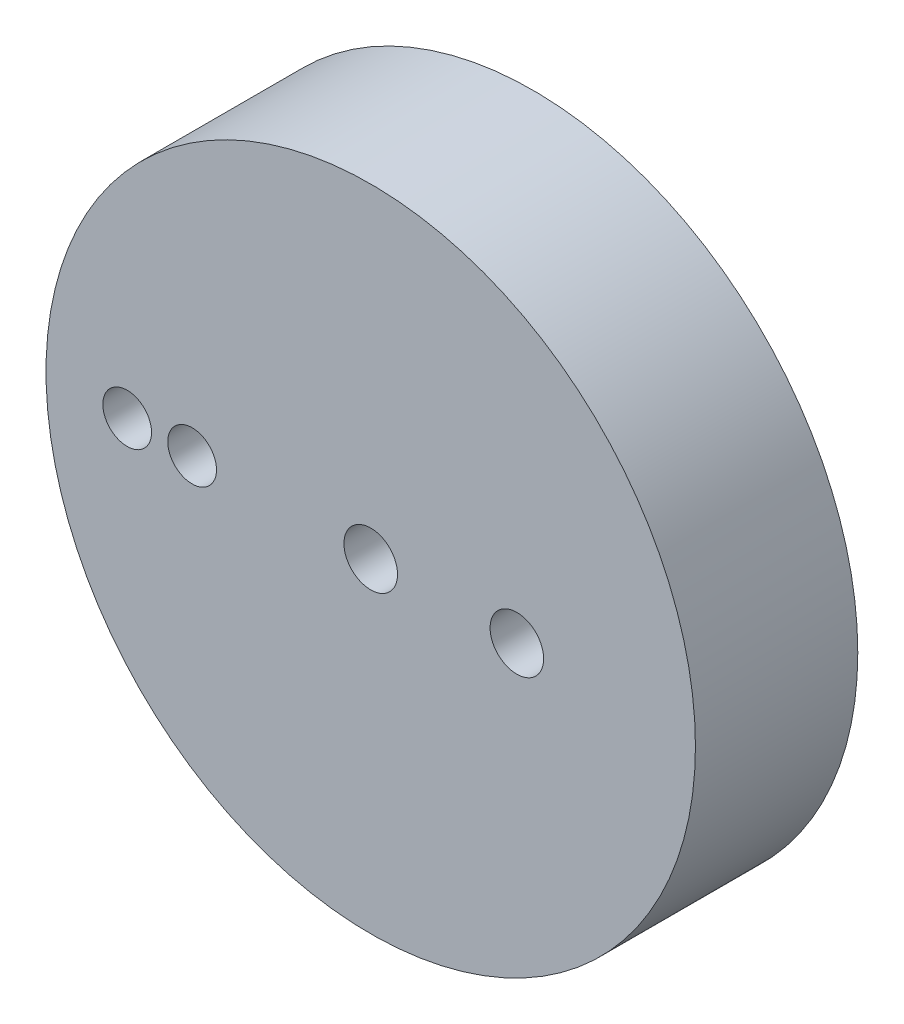
ISO-10303-21;
HEADER;
FILE_DESCRIPTION(('STEP AP214'),'2;1');
FILE_NAME('part.step','',(''),(''),'','','');
FILE_SCHEMA(('AUTOMOTIVE_DESIGN { 1 0 10303 214 1 1 1 1 }'));
ENDSEC;
DATA;
#1=APPLICATION_CONTEXT('core data for automotive mechanical design processes');
#2=APPLICATION_PROTOCOL_DEFINITION('international standard','automotive_design',2000,#1);
#3=PRODUCT_CONTEXT('',#1,'mechanical');
#4=PRODUCT('Part','Part','',(#3));
#5=PRODUCT_RELATED_PRODUCT_CATEGORY('part','',(#4));
#6=PRODUCT_DEFINITION_FORMATION('','',#4);
#7=PRODUCT_DEFINITION_CONTEXT('part definition',#1,'design');
#8=PRODUCT_DEFINITION('design','',#6,#7);
#9=PRODUCT_DEFINITION_SHAPE('','',#8);
#10=(LENGTH_UNIT() NAMED_UNIT(*) SI_UNIT(.MILLI.,.METRE.));
#11=(NAMED_UNIT(*) PLANE_ANGLE_UNIT() SI_UNIT($,.RADIAN.));
#12=(NAMED_UNIT(*) SI_UNIT($,.STERADIAN.) SOLID_ANGLE_UNIT());
#13=UNCERTAINTY_MEASURE_WITH_UNIT(LENGTH_MEASURE(1.E-05),#10,'distance_accuracy_value','');
#14=(GEOMETRIC_REPRESENTATION_CONTEXT(3) GLOBAL_UNCERTAINTY_ASSIGNED_CONTEXT((#13)) GLOBAL_UNIT_ASSIGNED_CONTEXT((#10,
#11,#12)) REPRESENTATION_CONTEXT('',''));
#15=CARTESIAN_POINT('',(0.,0.,0.));
#16=DIRECTION('',(0.,0.,1.));
#17=DIRECTION('',(1.,0.,0.));
#18=AXIS2_PLACEMENT_3D('',#15,#16,#17);
#19=CARTESIAN_POINT('',(0.,0.,21.));
#20=DIRECTION('',(0.,0.,-1.));
#21=DIRECTION('',(-1.,0.,0.));
#22=AXIS2_PLACEMENT_3D('',#19,#20,#21);
#23=CYLINDRICAL_SURFACE('',#22,7.7);
#24=DIRECTION('',(0.,0.,-1.));
#25=VECTOR('',#24,1.);
#26=CARTESIAN_POINT('',(-4.89963263929042,-5.94,21.));
#27=LINE('',#26,#25);
#28=CARTESIAN_POINT('',(-4.89963263929042,-5.94,17.5));
#29=VERTEX_POINT('',#28);
#30=CARTESIAN_POINT('',(-4.89963263929042,-5.94,11.));
#31=VERTEX_POINT('',#30);
#32=EDGE_CURVE('E11',#29,#31,#27,.T.);
#33=ORIENTED_EDGE('',*,*,#32,.F.);
#34=CARTESIAN_POINT('',(0.,0.,17.5));
#35=DIRECTION('',(0.,0.,1.));
#36=DIRECTION('',(1.,0.,0.));
#37=AXIS2_PLACEMENT_3D('',#34,#35,#36);
#38=CIRCLE('',#37,7.7);
#39=CARTESIAN_POINT('',(-4.89963263929042,5.93999999999999,17.5));
#40=VERTEX_POINT('',#39);
#41=EDGE_CURVE('E106',#29,#40,#38,.T.);
#42=ORIENTED_EDGE('',*,*,#41,.T.);
#43=DIRECTION('',(0.,0.,-1.));
#44=VECTOR('',#43,1.);
#45=CARTESIAN_POINT('',(-4.89963263929042,5.93999999999999,21.));
#46=LINE('',#45,#44);
#47=CARTESIAN_POINT('',(-4.89963263929042,5.93999999999999,11.));
#48=VERTEX_POINT('',#47);
#49=EDGE_CURVE('E91',#40,#48,#46,.T.);
#50=ORIENTED_EDGE('',*,*,#49,.T.);
#51=CARTESIAN_POINT('',(0.,0.,11.));
#52=DIRECTION('',(0.,0.,1.));
#53=DIRECTION('',(1.,0.,0.));
#54=AXIS2_PLACEMENT_3D('',#51,#52,#53);
#55=CIRCLE('',#54,7.7);
#56=EDGE_CURVE('E139',#31,#48,#55,.T.);
#57=ORIENTED_EDGE('',*,*,#56,.F.);
#58=EDGE_LOOP('',(#33,#42,#50,#57));
#59=FACE_BOUND('',#58,.T.);
#60=ADVANCED_FACE('F39',(#59),#23,.F.);
#61=CARTESIAN_POINT('',(-11.13552872566,-13.5,21.));
#62=DIRECTION('',(0.,0.,-1.));
#63=DIRECTION('',(-1.,0.,0.));
#64=AXIS2_PLACEMENT_3D('',#61,#62,#63);
#65=CYLINDRICAL_SURFACE('',#64,9.8);
#66=CARTESIAN_POINT('',(-11.13552872566,-13.5,17.5));
#67=DIRECTION('',(0.,0.,1.));
#68=DIRECTION('',(1.,0.,0.));
#69=AXIS2_PLACEMENT_3D('',#66,#67,#68);
#70=CIRCLE('',#69,9.8);
#71=CARTESIAN_POINT('',(-11.13552872566,-3.7,17.5));
#72=VERTEX_POINT('',#71);
#73=EDGE_CURVE('E53',#29,#72,#70,.T.);
#74=ORIENTED_EDGE('',*,*,#73,.F.);
#75=ORIENTED_EDGE('',*,*,#32,.T.);
#76=CARTESIAN_POINT('',(-11.13552872566,-13.5,11.));
#77=DIRECTION('',(0.,0.,1.));
#78=DIRECTION('',(1.,0.,0.));
#79=AXIS2_PLACEMENT_3D('',#76,#77,#78);
#80=CIRCLE('',#79,9.8);
#81=CARTESIAN_POINT('',(-11.13552872566,-3.7,11.));
#82=VERTEX_POINT('',#81);
#83=EDGE_CURVE('E141',#31,#82,#80,.T.);
#84=ORIENTED_EDGE('',*,*,#83,.T.);
#85=DIRECTION('',(0.,0.,-1.));
#86=VECTOR('',#85,1.);
#87=CARTESIAN_POINT('',(-11.13552872566,-3.7,21.));
#88=LINE('',#87,#86);
#89=EDGE_CURVE('E47',#72,#82,#88,.T.);
#90=ORIENTED_EDGE('',*,*,#89,.F.);
#91=EDGE_LOOP('',(#74,#75,#84,#90));
#92=FACE_BOUND('',#91,.T.);
#93=ADVANCED_FACE('F165',(#92),#65,.T.);
#94=CARTESIAN_POINT('',(0.,-3.7,21.));
#95=DIRECTION('',(0.,-1.,0.));
#96=DIRECTION('',(1.,0.,0.));
#97=AXIS2_PLACEMENT_3D('',#94,#95,#96);
#98=PLANE('',#97);
#99=DIRECTION('',(-1.,0.,0.));
#100=VECTOR('',#99,1.);
#101=CARTESIAN_POINT('',(0.,-3.7,17.5));
#102=LINE('',#101,#100);
#103=CARTESIAN_POINT('',(-24.,-3.7,17.5));
#104=VERTEX_POINT('',#103);
#105=EDGE_CURVE('E61',#72,#104,#102,.T.);
#106=ORIENTED_EDGE('',*,*,#105,.F.);
#107=ORIENTED_EDGE('',*,*,#89,.T.);
#108=DIRECTION('',(-1.,0.,0.));
#109=VECTOR('',#108,1.);
#110=CARTESIAN_POINT('',(0.,-3.7,11.));
#111=LINE('',#110,#109);
#112=CARTESIAN_POINT('',(-24.,-3.7,11.));
#113=VERTEX_POINT('',#112);
#114=EDGE_CURVE('E144',#82,#113,#111,.T.);
#115=ORIENTED_EDGE('',*,*,#114,.T.);
#116=DIRECTION('',(0.,0.,-1.));
#117=VECTOR('',#116,1.);
#118=CARTESIAN_POINT('',(-24.,-3.7,21.));
#119=LINE('',#118,#117);
#120=EDGE_CURVE('E157',#104,#113,#119,.T.);
#121=ORIENTED_EDGE('',*,*,#120,.F.);
#122=EDGE_LOOP('',(#106,#107,#115,#121));
#123=FACE_BOUND('',#122,.T.);
#124=ADVANCED_FACE('F159',(#123),#98,.F.);
#125=CARTESIAN_POINT('',(-24.,0.,21.));
#126=DIRECTION('',(0.,0.,-1.));
#127=DIRECTION('',(-1.,0.,0.));
#128=AXIS2_PLACEMENT_3D('',#125,#126,#127);
#129=CYLINDRICAL_SURFACE('',#128,3.7);
#130=DIRECTION('',(0.,0.,-1.));
#131=VECTOR('',#130,1.);
#132=CARTESIAN_POINT('',(-24.,3.7,21.));
#133=LINE('',#132,#131);
#134=CARTESIAN_POINT('',(-24.,3.7,17.5));
#135=VERTEX_POINT('',#134);
#136=CARTESIAN_POINT('',(-24.,3.7,11.));
#137=VERTEX_POINT('',#136);
#138=EDGE_CURVE('E155',#135,#137,#133,.T.);
#139=ORIENTED_EDGE('',*,*,#138,.F.);
#140=CARTESIAN_POINT('',(-24.,0.,17.5));
#141=DIRECTION('',(0.,0.,1.));
#142=DIRECTION('',(1.,0.,0.));
#143=AXIS2_PLACEMENT_3D('',#140,#141,#142);
#144=CIRCLE('',#143,3.7);
#145=EDGE_CURVE('E115',#135,#104,#144,.T.);
#146=ORIENTED_EDGE('',*,*,#145,.T.);
#147=ORIENTED_EDGE('',*,*,#120,.T.);
#148=CARTESIAN_POINT('',(-24.,0.,11.));
#149=DIRECTION('',(0.,0.,1.));
#150=DIRECTION('',(1.,0.,0.));
#151=AXIS2_PLACEMENT_3D('',#148,#149,#150);
#152=CIRCLE('',#151,3.7);
#153=EDGE_CURVE('E147',#137,#113,#152,.T.);
#154=ORIENTED_EDGE('',*,*,#153,.F.);
#155=EDGE_LOOP('',(#139,#146,#147,#154));
#156=FACE_BOUND('',#155,.T.);
#157=ADVANCED_FACE('F172',(#156),#129,.F.);
#158=CARTESIAN_POINT('',(0.,3.7,21.));
#159=DIRECTION('',(0.,1.,0.));
#160=DIRECTION('',(-1.,0.,0.));
#161=AXIS2_PLACEMENT_3D('',#158,#159,#160);
#162=PLANE('',#161);
#163=DIRECTION('',(1.,0.,0.));
#164=VECTOR('',#163,1.);
#165=CARTESIAN_POINT('',(0.,3.7,17.5));
#166=LINE('',#165,#164);
#167=CARTESIAN_POINT('',(-11.13552872566,3.7,17.5));
#168=VERTEX_POINT('',#167);
#169=EDGE_CURVE('E113',#135,#168,#166,.T.);
#170=ORIENTED_EDGE('',*,*,#169,.F.);
#171=ORIENTED_EDGE('',*,*,#138,.T.);
#172=DIRECTION('',(1.,0.,0.));
#173=VECTOR('',#172,1.);
#174=CARTESIAN_POINT('',(0.,3.7,11.));
#175=LINE('',#174,#173);
#176=CARTESIAN_POINT('',(-11.13552872566,3.7,11.));
#177=VERTEX_POINT('',#176);
#178=EDGE_CURVE('E150',#137,#177,#175,.T.);
#179=ORIENTED_EDGE('',*,*,#178,.T.);
#180=DIRECTION('',(0.,0.,-1.));
#181=VECTOR('',#180,1.);
#182=CARTESIAN_POINT('',(-11.13552872566,3.7,21.));
#183=LINE('',#182,#181);
#184=EDGE_CURVE('E102',#168,#177,#183,.T.);
#185=ORIENTED_EDGE('',*,*,#184,.F.);
#186=EDGE_LOOP('',(#170,#171,#179,#185));
#187=FACE_BOUND('',#186,.T.);
#188=ADVANCED_FACE('F178',(#187),#162,.F.);
#189=CARTESIAN_POINT('',(-11.13552872566,13.5,21.));
#190=DIRECTION('',(0.,0.,-1.));
#191=DIRECTION('',(-1.,0.,0.));
#192=AXIS2_PLACEMENT_3D('',#189,#190,#191);
#193=CYLINDRICAL_SURFACE('',#192,9.8);
#194=CARTESIAN_POINT('',(-11.13552872566,13.5,17.5));
#195=DIRECTION('',(0.,0.,1.));
#196=DIRECTION('',(1.,0.,0.));
#197=AXIS2_PLACEMENT_3D('',#194,#195,#196);
#198=CIRCLE('',#197,9.8);
#199=EDGE_CURVE('E95',#168,#40,#198,.T.);
#200=ORIENTED_EDGE('',*,*,#199,.F.);
#201=ORIENTED_EDGE('',*,*,#184,.T.);
#202=CARTESIAN_POINT('',(-11.13552872566,13.5,11.));
#203=DIRECTION('',(0.,0.,1.));
#204=DIRECTION('',(1.,0.,0.));
#205=AXIS2_PLACEMENT_3D('',#202,#203,#204);
#206=CIRCLE('',#205,9.8);
#207=EDGE_CURVE('E98',#177,#48,#206,.T.);
#208=ORIENTED_EDGE('',*,*,#207,.T.);
#209=ORIENTED_EDGE('',*,*,#49,.F.);
#210=EDGE_LOOP('',(#200,#201,#208,#209));
#211=FACE_BOUND('',#210,.T.);
#212=ADVANCED_FACE('F93',(#211),#193,.T.);
#213=CARTESIAN_POINT('',(-9.,0.,21.));
#214=DIRECTION('',(0.,0.,-1.));
#215=DIRECTION('',(-1.,0.,0.));
#216=AXIS2_PLACEMENT_3D('',#213,#214,#215);
#217=CYLINDRICAL_SURFACE('',#216,20.);
#218=CARTESIAN_POINT('',(-9.,0.,21.));
#219=DIRECTION('',(0.,0.,1.));
#220=DIRECTION('',(1.,0.,0.));
#221=AXIS2_PLACEMENT_3D('',#218,#219,#220);
#222=CIRCLE('',#221,20.);
#223=CARTESIAN_POINT('',(11.,0.,21.));
#224=VERTEX_POINT('',#223);
#225=EDGE_CURVE('E103',#224,#224,#222,.T.);
#226=ORIENTED_EDGE('',*,*,#225,.F.);
#227=EDGE_LOOP('',(#226));
#228=FACE_BOUND('',#227,.T.);
#229=CARTESIAN_POINT('',(-9.,0.,11.));
#230=DIRECTION('',(0.,0.,1.));
#231=DIRECTION('',(1.,0.,0.));
#232=AXIS2_PLACEMENT_3D('',#229,#230,#231);
#233=CIRCLE('',#232,20.);
#234=CARTESIAN_POINT('',(11.,0.,11.));
#235=VERTEX_POINT('',#234);
#236=EDGE_CURVE('E127',#235,#235,#233,.T.);
#237=ORIENTED_EDGE('',*,*,#236,.T.);
#238=EDGE_LOOP('',(#237));
#239=FACE_BOUND('',#238,.T.);
#240=ADVANCED_FACE('F41',(#228,#239),#217,.T.);
#241=CARTESIAN_POINT('',(0.,0.,21.));
#242=DIRECTION('',(0.,0.,1.));
#243=DIRECTION('',(1.,0.,0.));
#244=AXIS2_PLACEMENT_3D('',#241,#242,#243);
#245=PLANE('',#244);
#246=CARTESIAN_POINT('',(0.,0.,21.));
#247=DIRECTION('',(0.,0.,1.));
#248=DIRECTION('',(1.,0.,0.));
#249=AXIS2_PLACEMENT_3D('',#246,#247,#248);
#250=CIRCLE('',#249,1.65);
#251=CARTESIAN_POINT('',(1.65,0.,21.));
#252=VERTEX_POINT('',#251);
#253=EDGE_CURVE('E219',#252,#252,#250,.T.);
#254=ORIENTED_EDGE('',*,*,#253,.F.);
#255=EDGE_LOOP('',(#254));
#256=FACE_BOUND('',#255,.T.);
#257=CARTESIAN_POINT('',(-9.,0.,21.));
#258=DIRECTION('',(0.,0.,1.));
#259=DIRECTION('',(1.,0.,0.));
#260=AXIS2_PLACEMENT_3D('',#257,#258,#259);
#261=CIRCLE('',#260,1.65);
#262=CARTESIAN_POINT('',(-7.35,0.,21.));
#263=VERTEX_POINT('',#262);
#264=EDGE_CURVE('E220',#263,#263,#261,.T.);
#265=ORIENTED_EDGE('',*,*,#264,.F.);
#266=EDGE_LOOP('',(#265));
#267=FACE_BOUND('',#266,.T.);
#268=ORIENTED_EDGE('',*,*,#225,.T.);
#269=EDGE_LOOP('',(#268));
#270=FACE_BOUND('',#269,.T.);
#271=CARTESIAN_POINT('',(-24.,0.,21.));
#272=DIRECTION('',(0.,0.,1.));
#273=DIRECTION('',(1.,0.,0.));
#274=AXIS2_PLACEMENT_3D('',#271,#272,#273);
#275=CIRCLE('',#274,1.5);
#276=CARTESIAN_POINT('',(-22.5,0.,21.));
#277=VERTEX_POINT('',#276);
#278=EDGE_CURVE('E128',#277,#277,#275,.F.);
#279=ORIENTED_EDGE('',*,*,#278,.T.);
#280=EDGE_LOOP('',(#279));
#281=FACE_BOUND('',#280,.T.);
#282=CARTESIAN_POINT('',(-20.,0.,21.));
#283=DIRECTION('',(0.,0.,1.));
#284=DIRECTION('',(1.,0.,0.));
#285=AXIS2_PLACEMENT_3D('',#282,#283,#284);
#286=CIRCLE('',#285,1.5);
#287=CARTESIAN_POINT('',(-18.5,0.,21.));
#288=VERTEX_POINT('',#287);
#289=EDGE_CURVE('E131',#288,#288,#286,.F.);
#290=ORIENTED_EDGE('',*,*,#289,.T.);
#291=EDGE_LOOP('',(#290));
#292=FACE_BOUND('',#291,.T.);
#293=ADVANCED_FACE('F188',(#256,#267,#270,#281,#292),#245,.T.);
#294=CARTESIAN_POINT('',(0.,0.,11.));
#295=DIRECTION('',(0.,0.,1.));
#296=DIRECTION('',(1.,0.,0.));
#297=AXIS2_PLACEMENT_3D('',#294,#295,#296);
#298=PLANE('',#297);
#299=ORIENTED_EDGE('',*,*,#236,.F.);
#300=EDGE_LOOP('',(#299));
#301=FACE_BOUND('',#300,.T.);
#302=ORIENTED_EDGE('',*,*,#56,.T.);
#303=ORIENTED_EDGE('',*,*,#207,.F.);
#304=ORIENTED_EDGE('',*,*,#178,.F.);
#305=ORIENTED_EDGE('',*,*,#153,.T.);
#306=ORIENTED_EDGE('',*,*,#114,.F.);
#307=ORIENTED_EDGE('',*,*,#83,.F.);
#308=EDGE_LOOP('',(#302,#303,#304,#305,#306,#307));
#309=FACE_BOUND('',#308,.T.);
#310=ADVANCED_FACE('F162',(#301,#309),#298,.F.);
#311=CARTESIAN_POINT('',(-24.,0.,17.5));
#312=DIRECTION('',(0.,0.,1.));
#313=DIRECTION('',(1.,0.,0.));
#314=AXIS2_PLACEMENT_3D('',#311,#312,#313);
#315=CYLINDRICAL_SURFACE('',#314,1.5);
#316=CARTESIAN_POINT('',(-24.,0.,17.5));
#317=DIRECTION('',(0.,0.,1.));
#318=DIRECTION('',(1.,0.,0.));
#319=AXIS2_PLACEMENT_3D('',#316,#317,#318);
#320=CIRCLE('',#319,1.5);
#321=CARTESIAN_POINT('',(-22.5,0.,17.5));
#322=VERTEX_POINT('',#321);
#323=EDGE_CURVE('E121',#322,#322,#320,.F.);
#324=ORIENTED_EDGE('',*,*,#323,.T.);
#325=EDGE_LOOP('',(#324));
#326=FACE_BOUND('',#325,.T.);
#327=ORIENTED_EDGE('',*,*,#278,.F.);
#328=EDGE_LOOP('',(#327));
#329=FACE_BOUND('',#328,.T.);
#330=ADVANCED_FACE('F187',(#326,#329),#315,.F.);
#331=CARTESIAN_POINT('',(-20.,0.,17.5));
#332=DIRECTION('',(0.,0.,1.));
#333=DIRECTION('',(1.,0.,0.));
#334=AXIS2_PLACEMENT_3D('',#331,#332,#333);
#335=CYLINDRICAL_SURFACE('',#334,1.5);
#336=CARTESIAN_POINT('',(-20.,0.,17.5));
#337=DIRECTION('',(0.,0.,1.));
#338=DIRECTION('',(1.,0.,0.));
#339=AXIS2_PLACEMENT_3D('',#336,#337,#338);
#340=CIRCLE('',#339,1.5);
#341=CARTESIAN_POINT('',(-18.5,0.,17.5));
#342=VERTEX_POINT('',#341);
#343=EDGE_CURVE('E124',#342,#342,#340,.F.);
#344=ORIENTED_EDGE('',*,*,#343,.T.);
#345=EDGE_LOOP('',(#344));
#346=FACE_BOUND('',#345,.T.);
#347=ORIENTED_EDGE('',*,*,#289,.F.);
#348=EDGE_LOOP('',(#347));
#349=FACE_BOUND('',#348,.T.);
#350=ADVANCED_FACE('F195',(#346,#349),#335,.F.);
#351=CARTESIAN_POINT('',(0.,0.,17.5));
#352=DIRECTION('',(0.,0.,1.));
#353=DIRECTION('',(1.,0.,0.));
#354=AXIS2_PLACEMENT_3D('',#351,#352,#353);
#355=PLANE('',#354);
#356=CARTESIAN_POINT('',(0.,0.,17.5));
#357=DIRECTION('',(0.,0.,1.));
#358=DIRECTION('',(1.,0.,0.));
#359=AXIS2_PLACEMENT_3D('',#356,#357,#358);
#360=CIRCLE('',#359,1.65);
#361=CARTESIAN_POINT('',(1.65,0.,17.5));
#362=VERTEX_POINT('',#361);
#363=EDGE_CURVE('E132',#362,#362,#360,.F.);
#364=ORIENTED_EDGE('',*,*,#363,.F.);
#365=EDGE_LOOP('',(#364));
#366=FACE_BOUND('',#365,.T.);
#367=CARTESIAN_POINT('',(-9.,0.,17.5));
#368=DIRECTION('',(0.,0.,1.));
#369=DIRECTION('',(1.,0.,0.));
#370=AXIS2_PLACEMENT_3D('',#367,#368,#369);
#371=CIRCLE('',#370,1.65);
#372=CARTESIAN_POINT('',(-7.35,0.,17.5));
#373=VERTEX_POINT('',#372);
#374=EDGE_CURVE('E224',#373,#373,#371,.F.);
#375=ORIENTED_EDGE('',*,*,#374,.F.);
#376=EDGE_LOOP('',(#375));
#377=FACE_BOUND('',#376,.T.);
#378=ORIENTED_EDGE('',*,*,#73,.T.);
#379=ORIENTED_EDGE('',*,*,#105,.T.);
#380=ORIENTED_EDGE('',*,*,#145,.F.);
#381=ORIENTED_EDGE('',*,*,#169,.T.);
#382=ORIENTED_EDGE('',*,*,#199,.T.);
#383=ORIENTED_EDGE('',*,*,#41,.F.);
#384=EDGE_LOOP('',(#378,#379,#380,#381,#382,#383));
#385=FACE_BOUND('',#384,.T.);
#386=ORIENTED_EDGE('',*,*,#323,.F.);
#387=EDGE_LOOP('',(#386));
#388=FACE_BOUND('',#387,.T.);
#389=ORIENTED_EDGE('',*,*,#343,.F.);
#390=EDGE_LOOP('',(#389));
#391=FACE_BOUND('',#390,.T.);
#392=ADVANCED_FACE('F110',(#366,#377,#385,#388,#391),#355,.F.);
#393=CARTESIAN_POINT('',(-9.,0.,12.8330952441688));
#394=DIRECTION('',(0.,0.,1.));
#395=DIRECTION('',(1.,0.,0.));
#396=AXIS2_PLACEMENT_3D('',#393,#394,#395);
#397=CYLINDRICAL_SURFACE('',#396,1.65);
#398=ORIENTED_EDGE('',*,*,#374,.T.);
#399=EDGE_LOOP('',(#398));
#400=FACE_BOUND('',#399,.T.);
#401=ORIENTED_EDGE('',*,*,#264,.T.);
#402=EDGE_LOOP('',(#401));
#403=FACE_BOUND('',#402,.T.);
#404=ADVANCED_FACE('F202',(#400,#403),#397,.F.);
#405=CARTESIAN_POINT('',(0.,0.,12.8330952441688));
#406=DIRECTION('',(0.,0.,1.));
#407=DIRECTION('',(1.,0.,0.));
#408=AXIS2_PLACEMENT_3D('',#405,#406,#407);
#409=CYLINDRICAL_SURFACE('',#408,1.65);
#410=ORIENTED_EDGE('',*,*,#363,.T.);
#411=EDGE_LOOP('',(#410));
#412=FACE_BOUND('',#411,.T.);
#413=ORIENTED_EDGE('',*,*,#253,.T.);
#414=EDGE_LOOP('',(#413));
#415=FACE_BOUND('',#414,.T.);
#416=ADVANCED_FACE('F206',(#412,#415),#409,.F.);
#417=CLOSED_SHELL('',(#60,#93,#124,#157,#188,#212,#240,#293,#310,#330,#350,#392,#404,#416));
#418=MANIFOLD_SOLID_BREP('B2',#417);
#419=ADVANCED_BREP_SHAPE_REPRESENTATION('',(#18,#418),#14);
#420=SHAPE_DEFINITION_REPRESENTATION(#9,#419);
ENDSEC;
END-ISO-10303-21;
